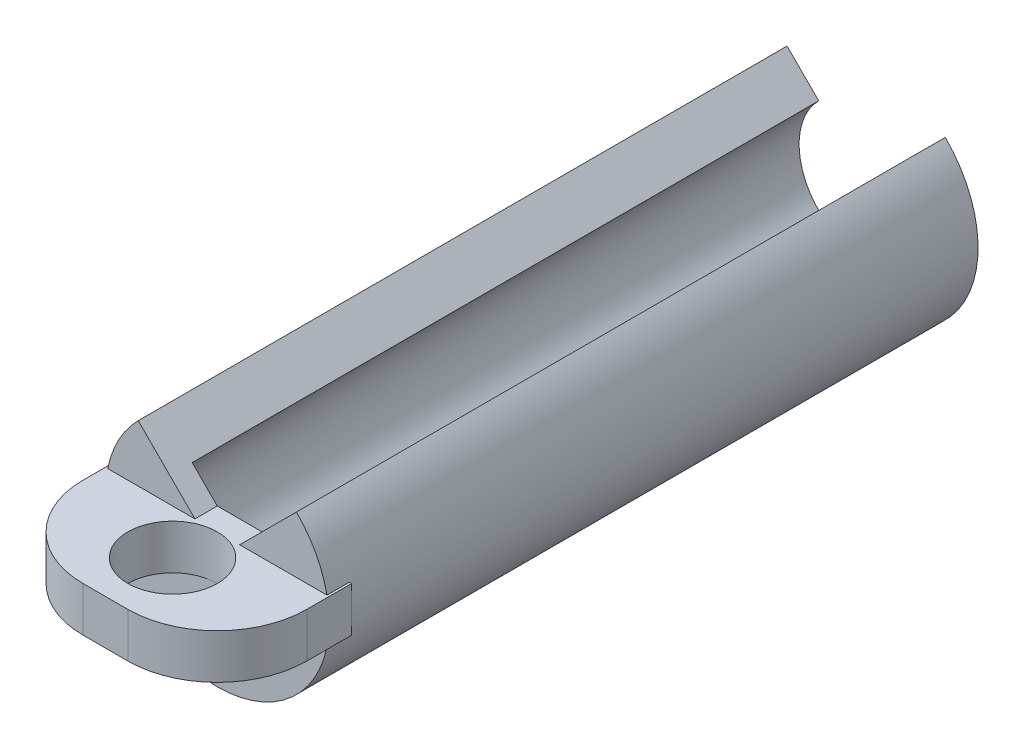
ISO-10303-21;
HEADER;
FILE_DESCRIPTION(('STEP AP214'),'2;1');
FILE_NAME('part.step','',(''),(''),'','','');
FILE_SCHEMA(('AUTOMOTIVE_DESIGN { 1 0 10303 214 1 1 1 1 }'));
ENDSEC;
DATA;
#1=APPLICATION_CONTEXT('core data for automotive mechanical design processes');
#2=APPLICATION_PROTOCOL_DEFINITION('international standard','automotive_design',2000,#1);
#3=PRODUCT_CONTEXT('',#1,'mechanical');
#4=PRODUCT('Part','Part','',(#3));
#5=PRODUCT_RELATED_PRODUCT_CATEGORY('part','',(#4));
#6=PRODUCT_DEFINITION_FORMATION('','',#4);
#7=PRODUCT_DEFINITION_CONTEXT('part definition',#1,'design');
#8=PRODUCT_DEFINITION('design','',#6,#7);
#9=PRODUCT_DEFINITION_SHAPE('','',#8);
#10=(LENGTH_UNIT() NAMED_UNIT(*) SI_UNIT(.MILLI.,.METRE.));
#11=(NAMED_UNIT(*) PLANE_ANGLE_UNIT() SI_UNIT($,.RADIAN.));
#12=(NAMED_UNIT(*) SI_UNIT($,.STERADIAN.) SOLID_ANGLE_UNIT());
#13=UNCERTAINTY_MEASURE_WITH_UNIT(LENGTH_MEASURE(1.E-05),#10,'distance_accuracy_value','');
#14=(GEOMETRIC_REPRESENTATION_CONTEXT(3) GLOBAL_UNCERTAINTY_ASSIGNED_CONTEXT((#13)) GLOBAL_UNIT_ASSIGNED_CONTEXT((#10,
#11,#12)) REPRESENTATION_CONTEXT('',''));
#15=CARTESIAN_POINT('',(0.,0.,0.));
#16=DIRECTION('',(0.,0.,1.));
#17=DIRECTION('',(1.,0.,0.));
#18=AXIS2_PLACEMENT_3D('',#15,#16,#17);
#19=CARTESIAN_POINT('',(0.,1.,29.));
#20=DIRECTION('',(0.,0.,-1.));
#21=DIRECTION('',(-1.,0.,0.));
#22=AXIS2_PLACEMENT_3D('',#19,#20,#21);
#23=PLANE('',#22);
#24=CARTESIAN_POINT('',(0.,0.,29.));
#25=DIRECTION('',(0.,0.,-1.));
#26=DIRECTION('',(-1.,0.,0.));
#27=AXIS2_PLACEMENT_3D('',#24,#25,#26);
#28=CIRCLE('',#27,5.);
#29=CARTESIAN_POINT('',(4.89897948556635,1.,29.));
#30=VERTEX_POINT('',#29);
#31=CARTESIAN_POINT('',(5.00000000000001,0.,29.));
#32=VERTEX_POINT('',#31);
#33=EDGE_CURVE('E219',#30,#32,#28,.T.);
#34=ORIENTED_EDGE('',*,*,#33,.F.);
#35=DIRECTION('',(1.,0.,0.));
#36=VECTOR('',#35,1.);
#37=CARTESIAN_POINT('',(0.,1.,29.));
#38=LINE('',#37,#36);
#39=CARTESIAN_POINT('',(5.00000000000001,1.,29.));
#40=VERTEX_POINT('',#39);
#41=EDGE_CURVE('E231',#30,#40,#38,.T.);
#42=ORIENTED_EDGE('',*,*,#41,.T.);
#43=DIRECTION('',(0.,-1.,0.));
#44=VECTOR('',#43,1.);
#45=CARTESIAN_POINT('',(5.00000000000001,1.,29.));
#46=LINE('',#45,#44);
#47=EDGE_CURVE('E275',#40,#32,#46,.T.);
#48=ORIENTED_EDGE('',*,*,#47,.T.);
#49=EDGE_LOOP('',(#34,#42,#48));
#50=FACE_BOUND('',#49,.T.);
#51=ADVANCED_FACE('F35',(#50),#23,.T.);
#52=CARTESIAN_POINT('',(-5.,0.,29.));
#53=VERTEX_POINT('',#52);
#54=CARTESIAN_POINT('',(-4.89897948556635,1.,29.));
#55=VERTEX_POINT('',#54);
#56=EDGE_CURVE('E58',#53,#55,#28,.T.);
#57=ORIENTED_EDGE('',*,*,#56,.F.);
#58=DIRECTION('',(0.,-1.,0.));
#59=VECTOR('',#58,1.);
#60=CARTESIAN_POINT('',(-5.,1.,29.));
#61=LINE('',#60,#59);
#62=CARTESIAN_POINT('',(-5.,1.,29.));
#63=VERTEX_POINT('',#62);
#64=EDGE_CURVE('E271',#63,#53,#61,.T.);
#65=ORIENTED_EDGE('',*,*,#64,.F.);
#66=EDGE_CURVE('E232',#63,#55,#38,.T.);
#67=ORIENTED_EDGE('',*,*,#66,.T.);
#68=EDGE_LOOP('',(#57,#65,#67));
#69=FACE_BOUND('',#68,.T.);
#70=ADVANCED_FACE('F338',(#69),#23,.T.);
#71=CARTESIAN_POINT('',(4.89897948556635,-1.,29.));
#72=VERTEX_POINT('',#71);
#73=EDGE_CURVE('E50',#32,#72,#28,.T.);
#74=ORIENTED_EDGE('',*,*,#73,.F.);
#75=CARTESIAN_POINT('',(5.00000000000001,-1.,29.));
#76=VERTEX_POINT('',#75);
#77=EDGE_CURVE('E274',#32,#76,#46,.T.);
#78=ORIENTED_EDGE('',*,*,#77,.T.);
#79=DIRECTION('',(1.,0.,0.));
#80=VECTOR('',#79,1.);
#81=CARTESIAN_POINT('',(0.,-1.,29.));
#82=LINE('',#81,#80);
#83=EDGE_CURVE('E250',#72,#76,#82,.T.);
#84=ORIENTED_EDGE('',*,*,#83,.F.);
#85=EDGE_LOOP('',(#74,#78,#84));
#86=FACE_BOUND('',#85,.T.);
#87=ADVANCED_FACE('F316',(#86),#23,.T.);
#88=CARTESIAN_POINT('',(-0.999999999999997,1.,29.));
#89=VERTEX_POINT('',#88);
#90=CARTESIAN_POINT('',(0.999999999999982,1.,29.));
#91=VERTEX_POINT('',#90);
#92=EDGE_CURVE('E235',#89,#91,#38,.T.);
#93=ORIENTED_EDGE('',*,*,#92,.T.);
#94=DIRECTION('',(-0.707106781186541,-0.707106781186554,0.));
#95=VECTOR('',#94,1.);
#96=CARTESIAN_POINT('',(0.,0.,29.));
#97=LINE('',#96,#95);
#98=CARTESIAN_POINT('',(2.12132034355962,2.12132034355966,29.));
#99=VERTEX_POINT('',#98);
#100=EDGE_CURVE('E199',#99,#91,#97,.T.);
#101=ORIENTED_EDGE('',*,*,#100,.F.);
#102=CARTESIAN_POINT('',(0.,0.,29.));
#103=DIRECTION('',(0.,0.,-1.));
#104=DIRECTION('',(-1.,0.,0.));
#105=AXIS2_PLACEMENT_3D('',#102,#103,#104);
#106=CIRCLE('',#105,3.);
#107=CARTESIAN_POINT('',(-2.12132034355964,2.12132034355964,29.));
#108=VERTEX_POINT('',#107);
#109=EDGE_CURVE('E170',#99,#108,#106,.T.);
#110=ORIENTED_EDGE('',*,*,#109,.T.);
#111=DIRECTION('',(0.707106781186546,-0.707106781186549,0.));
#112=VECTOR('',#111,1.);
#113=CARTESIAN_POINT('',(0.,0.,29.));
#114=LINE('',#113,#112);
#115=EDGE_CURVE('E184',#108,#89,#114,.T.);
#116=ORIENTED_EDGE('',*,*,#115,.T.);
#117=EDGE_LOOP('',(#93,#101,#110,#116));
#118=FACE_BOUND('',#117,.T.);
#119=ADVANCED_FACE('F290',(#118),#23,.T.);
#120=CARTESIAN_POINT('',(1.00000000000001,1.,31.));
#121=DIRECTION('',(0.,-1.,0.));
#122=DIRECTION('',(0.,0.,-1.));
#123=AXIS2_PLACEMENT_3D('',#120,#121,#122);
#124=CYLINDRICAL_SURFACE('',#123,4.);
#125=CARTESIAN_POINT('',(1.00000000000001,-1.,31.));
#126=DIRECTION('',(0.,1.,0.));
#127=DIRECTION('',(0.,0.,1.));
#128=AXIS2_PLACEMENT_3D('',#125,#126,#127);
#129=CIRCLE('',#128,4.);
#130=CARTESIAN_POINT('',(0.99999999999998,-1.,35.));
#131=VERTEX_POINT('',#130);
#132=CARTESIAN_POINT('',(5.00000000000001,-1.,31.));
#133=VERTEX_POINT('',#132);
#134=EDGE_CURVE('E224',#131,#133,#129,.T.);
#135=ORIENTED_EDGE('',*,*,#134,.T.);
#136=DIRECTION('',(0.,-1.,0.));
#137=VECTOR('',#136,1.);
#138=CARTESIAN_POINT('',(5.00000000000001,1.,31.));
#139=LINE('',#138,#137);
#140=CARTESIAN_POINT('',(5.00000000000001,1.,31.));
#141=VERTEX_POINT('',#140);
#142=EDGE_CURVE('E278',#141,#133,#139,.T.);
#143=ORIENTED_EDGE('',*,*,#142,.F.);
#144=CARTESIAN_POINT('',(1.00000000000001,1.,31.));
#145=DIRECTION('',(0.,1.,0.));
#146=DIRECTION('',(0.,0.,1.));
#147=AXIS2_PLACEMENT_3D('',#144,#145,#146);
#148=CIRCLE('',#147,4.);
#149=CARTESIAN_POINT('',(0.99999999999998,1.,35.));
#150=VERTEX_POINT('',#149);
#151=EDGE_CURVE('E225',#150,#141,#148,.T.);
#152=ORIENTED_EDGE('',*,*,#151,.F.);
#153=DIRECTION('',(0.,-1.,0.));
#154=VECTOR('',#153,1.);
#155=CARTESIAN_POINT('',(0.99999999999998,1.,35.));
#156=LINE('',#155,#154);
#157=EDGE_CURVE('E244',#150,#131,#156,.T.);
#158=ORIENTED_EDGE('',*,*,#157,.T.);
#159=EDGE_LOOP('',(#135,#143,#152,#158));
#160=FACE_BOUND('',#159,.T.);
#161=ADVANCED_FACE('F37',(#160),#124,.T.);
#162=CARTESIAN_POINT('',(5.,1.,0.));
#163=DIRECTION('',(1.,0.,0.));
#164=DIRECTION('',(0.,0.,-1.));
#165=AXIS2_PLACEMENT_3D('',#162,#163,#164);
#166=PLANE('',#165);
#167=ORIENTED_EDGE('',*,*,#77,.F.);
#168=ORIENTED_EDGE('',*,*,#47,.F.);
#169=DIRECTION('',(0.,0.,1.));
#170=VECTOR('',#169,1.);
#171=CARTESIAN_POINT('',(5.,1.,0.));
#172=LINE('',#171,#170);
#173=EDGE_CURVE('E227',#40,#141,#172,.T.);
#174=ORIENTED_EDGE('',*,*,#173,.T.);
#175=ORIENTED_EDGE('',*,*,#142,.T.);
#176=DIRECTION('',(0.,0.,1.));
#177=VECTOR('',#176,1.);
#178=CARTESIAN_POINT('',(5.,-1.,0.));
#179=LINE('',#178,#177);
#180=EDGE_CURVE('E247',#76,#133,#179,.T.);
#181=ORIENTED_EDGE('',*,*,#180,.F.);
#182=EDGE_LOOP('',(#167,#168,#174,#175,#181));
#183=FACE_BOUND('',#182,.T.);
#184=ADVANCED_FACE('F313',(#183),#166,.T.);
#185=CARTESIAN_POINT('',(-4.89897948556635,-1.,29.));
#186=VERTEX_POINT('',#185);
#187=EDGE_CURVE('E216',#186,#53,#28,.T.);
#188=ORIENTED_EDGE('',*,*,#187,.F.);
#189=CARTESIAN_POINT('',(-5.,-1.,29.));
#190=VERTEX_POINT('',#189);
#191=EDGE_CURVE('E251',#190,#186,#82,.T.);
#192=ORIENTED_EDGE('',*,*,#191,.F.);
#193=EDGE_CURVE('E270',#53,#190,#61,.T.);
#194=ORIENTED_EDGE('',*,*,#193,.F.);
#195=EDGE_LOOP('',(#188,#192,#194));
#196=FACE_BOUND('',#195,.T.);
#197=ADVANCED_FACE('F332',(#196),#23,.T.);
#198=CARTESIAN_POINT('',(-5.,1.,0.));
#199=DIRECTION('',(1.,0.,0.));
#200=DIRECTION('',(0.,0.,-1.));
#201=AXIS2_PLACEMENT_3D('',#198,#199,#200);
#202=PLANE('',#201);
#203=ORIENTED_EDGE('',*,*,#64,.T.);
#204=ORIENTED_EDGE('',*,*,#193,.T.);
#205=DIRECTION('',(0.,0.,1.));
#206=VECTOR('',#205,1.);
#207=CARTESIAN_POINT('',(-5.,-1.,0.));
#208=LINE('',#207,#206);
#209=CARTESIAN_POINT('',(-5.,-1.,31.));
#210=VERTEX_POINT('',#209);
#211=EDGE_CURVE('E254',#190,#210,#208,.T.);
#212=ORIENTED_EDGE('',*,*,#211,.T.);
#213=DIRECTION('',(0.,-1.,0.));
#214=VECTOR('',#213,1.);
#215=CARTESIAN_POINT('',(-5.,1.,31.));
#216=LINE('',#215,#214);
#217=CARTESIAN_POINT('',(-5.,1.,31.));
#218=VERTEX_POINT('',#217);
#219=EDGE_CURVE('E267',#218,#210,#216,.T.);
#220=ORIENTED_EDGE('',*,*,#219,.F.);
#221=DIRECTION('',(0.,0.,1.));
#222=VECTOR('',#221,1.);
#223=CARTESIAN_POINT('',(-5.,1.,0.));
#224=LINE('',#223,#222);
#225=EDGE_CURVE('E234',#63,#218,#224,.T.);
#226=ORIENTED_EDGE('',*,*,#225,.F.);
#227=EDGE_LOOP('',(#203,#204,#212,#220,#226));
#228=FACE_BOUND('',#227,.T.);
#229=ADVANCED_FACE('F335',(#228),#202,.F.);
#230=CARTESIAN_POINT('',(-0.999999999999996,1.,31.));
#231=DIRECTION('',(0.,-1.,0.));
#232=DIRECTION('',(0.,0.,-1.));
#233=AXIS2_PLACEMENT_3D('',#230,#231,#232);
#234=CYLINDRICAL_SURFACE('',#233,4.);
#235=CARTESIAN_POINT('',(-0.999999999999996,-1.,31.));
#236=DIRECTION('',(0.,1.,0.));
#237=DIRECTION('',(0.,0.,1.));
#238=AXIS2_PLACEMENT_3D('',#235,#236,#237);
#239=CIRCLE('',#238,4.);
#240=CARTESIAN_POINT('',(-0.999999999999967,-1.,35.));
#241=VERTEX_POINT('',#240);
#242=EDGE_CURVE('E256',#210,#241,#239,.T.);
#243=ORIENTED_EDGE('',*,*,#242,.T.);
#244=DIRECTION('',(0.,-1.,0.));
#245=VECTOR('',#244,1.);
#246=CARTESIAN_POINT('',(-0.999999999999967,1.,35.));
#247=LINE('',#246,#245);
#248=CARTESIAN_POINT('',(-0.999999999999967,1.,35.));
#249=VERTEX_POINT('',#248);
#250=EDGE_CURVE('E264',#249,#241,#247,.T.);
#251=ORIENTED_EDGE('',*,*,#250,.F.);
#252=CARTESIAN_POINT('',(-0.999999999999996,1.,31.));
#253=DIRECTION('',(0.,1.,0.));
#254=DIRECTION('',(0.,0.,1.));
#255=AXIS2_PLACEMENT_3D('',#252,#253,#254);
#256=CIRCLE('',#255,4.);
#257=EDGE_CURVE('E237',#218,#249,#256,.T.);
#258=ORIENTED_EDGE('',*,*,#257,.F.);
#259=ORIENTED_EDGE('',*,*,#219,.T.);
#260=EDGE_LOOP('',(#243,#251,#258,#259));
#261=FACE_BOUND('',#260,.T.);
#262=ADVANCED_FACE('F343',(#261),#234,.T.);
#263=CARTESIAN_POINT('',(0.,1.,35.));
#264=DIRECTION('',(0.,0.,-1.));
#265=DIRECTION('',(-1.,0.,0.));
#266=AXIS2_PLACEMENT_3D('',#263,#264,#265);
#267=PLANE('',#266);
#268=DIRECTION('',(1.,0.,0.));
#269=VECTOR('',#268,1.);
#270=CARTESIAN_POINT('',(0.,-1.,35.));
#271=LINE('',#270,#269);
#272=EDGE_CURVE('E258',#241,#131,#271,.T.);
#273=ORIENTED_EDGE('',*,*,#272,.T.);
#274=ORIENTED_EDGE('',*,*,#157,.F.);
#275=DIRECTION('',(1.,0.,0.));
#276=VECTOR('',#275,1.);
#277=CARTESIAN_POINT('',(0.,1.,35.));
#278=LINE('',#277,#276);
#279=EDGE_CURVE('E239',#249,#150,#278,.T.);
#280=ORIENTED_EDGE('',*,*,#279,.F.);
#281=ORIENTED_EDGE('',*,*,#250,.T.);
#282=EDGE_LOOP('',(#273,#274,#280,#281));
#283=FACE_BOUND('',#282,.T.);
#284=ADVANCED_FACE('F348',(#283),#267,.F.);
#285=CARTESIAN_POINT('',(0.,1.,32.));
#286=DIRECTION('',(0.,-1.,0.));
#287=DIRECTION('',(0.,0.,-1.));
#288=AXIS2_PLACEMENT_3D('',#285,#286,#287);
#289=CYLINDRICAL_SURFACE('',#288,2.);
#290=CARTESIAN_POINT('',(0.,-1.,32.));
#291=DIRECTION('',(0.,1.,0.));
#292=DIRECTION('',(0.,0.,1.));
#293=AXIS2_PLACEMENT_3D('',#290,#291,#292);
#294=CIRCLE('',#293,2.);
#295=CARTESIAN_POINT('',(0.,-1.,30.));
#296=VERTEX_POINT('',#295);
#297=EDGE_CURVE('E228',#296,#296,#294,.T.);
#298=ORIENTED_EDGE('',*,*,#297,.F.);
#299=EDGE_LOOP('',(#298));
#300=FACE_BOUND('',#299,.T.);
#301=CARTESIAN_POINT('',(0.,1.,32.));
#302=DIRECTION('',(0.,1.,0.));
#303=DIRECTION('',(0.,0.,1.));
#304=AXIS2_PLACEMENT_3D('',#301,#302,#303);
#305=CIRCLE('',#304,2.);
#306=CARTESIAN_POINT('',(0.,1.,34.));
#307=VERTEX_POINT('',#306);
#308=EDGE_CURVE('E241',#307,#307,#305,.T.);
#309=ORIENTED_EDGE('',*,*,#308,.T.);
#310=EDGE_LOOP('',(#309));
#311=FACE_BOUND('',#310,.T.);
#312=ADVANCED_FACE('F374',(#300,#311),#289,.F.);
#313=CARTESIAN_POINT('',(0.,1.,0.));
#314=DIRECTION('',(0.,1.,0.));
#315=DIRECTION('',(0.,0.,1.));
#316=AXIS2_PLACEMENT_3D('',#313,#314,#315);
#317=PLANE('',#316);
#318=DIRECTION('',(0.,0.,-1.));
#319=VECTOR('',#318,1.);
#320=CARTESIAN_POINT('',(4.89897948556635,1.,0.));
#321=LINE('',#320,#319);
#322=CARTESIAN_POINT('',(4.89897948556635,1.,30.));
#323=VERTEX_POINT('',#322);
#324=EDGE_CURVE('E221',#323,#30,#321,.T.);
#325=ORIENTED_EDGE('',*,*,#324,.F.);
#326=DIRECTION('',(1.,0.,0.));
#327=VECTOR('',#326,1.);
#328=CARTESIAN_POINT('',(0.,1.,30.));
#329=LINE('',#328,#327);
#330=CARTESIAN_POINT('',(0.999999999999982,1.,30.));
#331=VERTEX_POINT('',#330);
#332=EDGE_CURVE('E213',#331,#323,#329,.T.);
#333=ORIENTED_EDGE('',*,*,#332,.F.);
#334=DIRECTION('',(0.,0.,-1.));
#335=VECTOR('',#334,1.);
#336=CARTESIAN_POINT('',(0.999999999999982,1.,0.));
#337=LINE('',#336,#335);
#338=EDGE_CURVE('E11',#331,#91,#337,.T.);
#339=ORIENTED_EDGE('',*,*,#338,.T.);
#340=ORIENTED_EDGE('',*,*,#92,.F.);
#341=DIRECTION('',(0.,0.,-1.));
#342=VECTOR('',#341,1.);
#343=CARTESIAN_POINT('',(-0.999999999999997,1.,0.));
#344=LINE('',#343,#342);
#345=CARTESIAN_POINT('',(-0.999999999999997,1.,30.));
#346=VERTEX_POINT('',#345);
#347=EDGE_CURVE('E43',#346,#89,#344,.T.);
#348=ORIENTED_EDGE('',*,*,#347,.F.);
#349=CARTESIAN_POINT('',(-4.89897948556635,1.,30.));
#350=VERTEX_POINT('',#349);
#351=EDGE_CURVE('E183',#350,#346,#329,.T.);
#352=ORIENTED_EDGE('',*,*,#351,.F.);
#353=DIRECTION('',(0.,0.,-1.));
#354=VECTOR('',#353,1.);
#355=CARTESIAN_POINT('',(-4.89897948556635,1.,0.));
#356=LINE('',#355,#354);
#357=EDGE_CURVE('E165',#55,#350,#356,.F.);
#358=ORIENTED_EDGE('',*,*,#357,.F.);
#359=ORIENTED_EDGE('',*,*,#66,.F.);
#360=ORIENTED_EDGE('',*,*,#225,.T.);
#361=ORIENTED_EDGE('',*,*,#257,.T.);
#362=ORIENTED_EDGE('',*,*,#279,.T.);
#363=ORIENTED_EDGE('',*,*,#151,.T.);
#364=ORIENTED_EDGE('',*,*,#173,.F.);
#365=ORIENTED_EDGE('',*,*,#41,.F.);
#366=EDGE_LOOP('',(#325,#333,#339,#340,#348,#352,#358,#359,#360,#361,#362,#363,#364,#365));
#367=FACE_BOUND('',#366,.T.);
#368=ORIENTED_EDGE('',*,*,#308,.F.);
#369=EDGE_LOOP('',(#368));
#370=FACE_BOUND('',#369,.T.);
#371=ADVANCED_FACE('F307',(#367,#370),#317,.T.);
#372=CARTESIAN_POINT('',(0.,-1.,0.));
#373=DIRECTION('',(0.,1.,0.));
#374=DIRECTION('',(0.,0.,1.));
#375=AXIS2_PLACEMENT_3D('',#372,#373,#374);
#376=PLANE('',#375);
#377=DIRECTION('',(1.,0.,0.));
#378=VECTOR('',#377,1.);
#379=CARTESIAN_POINT('',(0.,-1.,30.));
#380=LINE('',#379,#378);
#381=CARTESIAN_POINT('',(4.89897948556635,-1.,30.));
#382=VERTEX_POINT('',#381);
#383=EDGE_CURVE('E280',#296,#382,#380,.T.);
#384=ORIENTED_EDGE('',*,*,#383,.T.);
#385=DIRECTION('',(0.,0.,-1.));
#386=VECTOR('',#385,1.);
#387=CARTESIAN_POINT('',(4.89897948556635,-1.,0.));
#388=LINE('',#387,#386);
#389=EDGE_CURVE('E285',#382,#72,#388,.T.);
#390=ORIENTED_EDGE('',*,*,#389,.T.);
#391=ORIENTED_EDGE('',*,*,#83,.T.);
#392=ORIENTED_EDGE('',*,*,#180,.T.);
#393=ORIENTED_EDGE('',*,*,#134,.F.);
#394=ORIENTED_EDGE('',*,*,#272,.F.);
#395=ORIENTED_EDGE('',*,*,#242,.F.);
#396=ORIENTED_EDGE('',*,*,#211,.F.);
#397=ORIENTED_EDGE('',*,*,#191,.T.);
#398=DIRECTION('',(0.,0.,-1.));
#399=VECTOR('',#398,1.);
#400=CARTESIAN_POINT('',(-4.89897948556635,-1.,0.));
#401=LINE('',#400,#399);
#402=CARTESIAN_POINT('',(-4.89897948556635,-1.,30.));
#403=VERTEX_POINT('',#402);
#404=EDGE_CURVE('E283',#186,#403,#401,.F.);
#405=ORIENTED_EDGE('',*,*,#404,.T.);
#406=EDGE_CURVE('E282',#403,#296,#380,.T.);
#407=ORIENTED_EDGE('',*,*,#406,.T.);
#408=ORIENTED_EDGE('',*,*,#297,.T.);
#409=EDGE_LOOP('',(#384,#390,#391,#392,#393,#394,#395,#396,#397,#405,#407,#408));
#410=FACE_BOUND('',#409,.T.);
#411=ADVANCED_FACE('F318',(#410),#376,.F.);
#412=CARTESIAN_POINT('',(0.,0.,30.));
#413=DIRECTION('',(0.,0.,1.));
#414=DIRECTION('',(1.,0.,0.));
#415=AXIS2_PLACEMENT_3D('',#412,#413,#414);
#416=PLANE('',#415);
#417=CARTESIAN_POINT('',(0.,0.,30.));
#418=DIRECTION('',(0.,0.,-1.));
#419=DIRECTION('',(-1.,0.,0.));
#420=AXIS2_PLACEMENT_3D('',#417,#418,#419);
#421=CIRCLE('',#420,5.);
#422=CARTESIAN_POINT('',(-3.53553390593273,3.53553390593274,30.));
#423=VERTEX_POINT('',#422);
#424=EDGE_CURVE('E159',#350,#423,#421,.T.);
#425=ORIENTED_EDGE('',*,*,#424,.F.);
#426=ORIENTED_EDGE('',*,*,#351,.T.);
#427=DIRECTION('',(0.707106781186546,-0.707106781186549,0.));
#428=VECTOR('',#427,1.);
#429=CARTESIAN_POINT('',(0.,0.,30.));
#430=LINE('',#429,#428);
#431=EDGE_CURVE('E177',#423,#346,#430,.T.);
#432=ORIENTED_EDGE('',*,*,#431,.F.);
#433=EDGE_LOOP('',(#425,#426,#432));
#434=FACE_BOUND('',#433,.T.);
#435=ADVANCED_FACE('F182',(#434),#416,.T.);
#436=ORIENTED_EDGE('',*,*,#406,.F.);
#437=EDGE_CURVE('E169',#382,#403,#421,.T.);
#438=ORIENTED_EDGE('',*,*,#437,.F.);
#439=ORIENTED_EDGE('',*,*,#383,.F.);
#440=EDGE_LOOP('',(#436,#438,#439));
#441=FACE_BOUND('',#440,.T.);
#442=ADVANCED_FACE('F327',(#441),#416,.T.);
#443=CARTESIAN_POINT('',(0.,0.,0.));
#444=DIRECTION('',(0.,0.,-1.));
#445=DIRECTION('',(-1.,0.,0.));
#446=AXIS2_PLACEMENT_3D('',#443,#444,#445);
#447=CYLINDRICAL_SURFACE('',#446,5.);
#448=CARTESIAN_POINT('',(3.5355339059327,3.53553390593277,30.));
#449=VERTEX_POINT('',#448);
#450=EDGE_CURVE('E172',#449,#323,#421,.T.);
#451=ORIENTED_EDGE('',*,*,#450,.T.);
#452=ORIENTED_EDGE('',*,*,#324,.T.);
#453=ORIENTED_EDGE('',*,*,#33,.T.);
#454=ORIENTED_EDGE('',*,*,#73,.T.);
#455=ORIENTED_EDGE('',*,*,#389,.F.);
#456=ORIENTED_EDGE('',*,*,#437,.T.);
#457=ORIENTED_EDGE('',*,*,#404,.F.);
#458=ORIENTED_EDGE('',*,*,#187,.T.);
#459=ORIENTED_EDGE('',*,*,#56,.T.);
#460=ORIENTED_EDGE('',*,*,#357,.T.);
#461=ORIENTED_EDGE('',*,*,#424,.T.);
#462=DIRECTION('',(0.,0.,1.));
#463=VECTOR('',#462,1.);
#464=CARTESIAN_POINT('',(-3.53553390593273,3.53553390593274,0.));
#465=LINE('',#464,#463);
#466=CARTESIAN_POINT('',(-3.53553390593273,3.53553390593274,1.));
#467=VERTEX_POINT('',#466);
#468=EDGE_CURVE('E163',#467,#423,#465,.T.);
#469=ORIENTED_EDGE('',*,*,#468,.F.);
#470=CARTESIAN_POINT('',(0.,0.,1.));
#471=DIRECTION('',(0.,0.,-1.));
#472=DIRECTION('',(-1.,0.,0.));
#473=AXIS2_PLACEMENT_3D('',#470,#471,#472);
#474=CIRCLE('',#473,5.);
#475=CARTESIAN_POINT('',(3.53553390593271,3.53553390593277,1.));
#476=VERTEX_POINT('',#475);
#477=EDGE_CURVE('E208',#476,#467,#474,.T.);
#478=ORIENTED_EDGE('',*,*,#477,.F.);
#479=DIRECTION('',(0.,0.,1.));
#480=VECTOR('',#479,1.);
#481=CARTESIAN_POINT('',(3.53553390593271,3.53553390593277,0.));
#482=LINE('',#481,#480);
#483=EDGE_CURVE('E193',#476,#449,#482,.T.);
#484=ORIENTED_EDGE('',*,*,#483,.T.);
#485=EDGE_LOOP('',(#451,#452,#453,#454,#455,#456,#457,#458,#459,#460,#461,#469,#478,#484));
#486=FACE_BOUND('',#485,.T.);
#487=ADVANCED_FACE('F162',(#486),#447,.T.);
#488=DIRECTION('',(-0.707106781186541,-0.707106781186554,0.));
#489=VECTOR('',#488,1.);
#490=CARTESIAN_POINT('',(0.,0.,30.));
#491=LINE('',#490,#489);
#492=EDGE_CURVE('E196',#449,#331,#491,.T.);
#493=ORIENTED_EDGE('',*,*,#492,.T.);
#494=ORIENTED_EDGE('',*,*,#332,.T.);
#495=ORIENTED_EDGE('',*,*,#450,.F.);
#496=EDGE_LOOP('',(#493,#494,#495));
#497=FACE_BOUND('',#496,.T.);
#498=ADVANCED_FACE('F304',(#497),#416,.T.);
#499=CARTESIAN_POINT('',(0.,0.,0.));
#500=DIRECTION('',(0.,0.,-1.));
#501=DIRECTION('',(-1.,0.,0.));
#502=AXIS2_PLACEMENT_3D('',#499,#500,#501);
#503=CYLINDRICAL_SURFACE('',#502,3.);
#504=CARTESIAN_POINT('',(0.,0.,1.));
#505=DIRECTION('',(0.,0.,-1.));
#506=DIRECTION('',(-1.,0.,0.));
#507=AXIS2_PLACEMENT_3D('',#504,#505,#506);
#508=CIRCLE('',#507,3.);
#509=CARTESIAN_POINT('',(2.12132034355962,2.12132034355966,1.));
#510=VERTEX_POINT('',#509);
#511=CARTESIAN_POINT('',(-2.12132034355964,2.12132034355965,1.));
#512=VERTEX_POINT('',#511);
#513=EDGE_CURVE('E210',#510,#512,#508,.T.);
#514=ORIENTED_EDGE('',*,*,#513,.T.);
#515=DIRECTION('',(0.,0.,1.));
#516=VECTOR('',#515,1.);
#517=CARTESIAN_POINT('',(-2.12132034355964,2.12132034355965,0.));
#518=LINE('',#517,#516);
#519=EDGE_CURVE('E187',#512,#108,#518,.T.);
#520=ORIENTED_EDGE('',*,*,#519,.T.);
#521=ORIENTED_EDGE('',*,*,#109,.F.);
#522=DIRECTION('',(0.,0.,1.));
#523=VECTOR('',#522,1.);
#524=CARTESIAN_POINT('',(2.12132034355962,2.12132034355966,0.));
#525=LINE('',#524,#523);
#526=EDGE_CURVE('E202',#510,#99,#525,.T.);
#527=ORIENTED_EDGE('',*,*,#526,.F.);
#528=EDGE_LOOP('',(#514,#520,#521,#527));
#529=FACE_BOUND('',#528,.T.);
#530=ADVANCED_FACE('F294',(#529),#503,.F.);
#531=CARTESIAN_POINT('',(0.,0.,1.));
#532=DIRECTION('',(0.,0.,1.));
#533=DIRECTION('',(1.,0.,0.));
#534=AXIS2_PLACEMENT_3D('',#531,#532,#533);
#535=PLANE('',#534);
#536=DIRECTION('',(-0.707106781186541,-0.707106781186554,0.));
#537=VECTOR('',#536,1.);
#538=CARTESIAN_POINT('',(0.,0.,1.));
#539=LINE('',#538,#537);
#540=EDGE_CURVE('E205',#476,#510,#539,.T.);
#541=ORIENTED_EDGE('',*,*,#540,.F.);
#542=ORIENTED_EDGE('',*,*,#477,.T.);
#543=DIRECTION('',(0.707106781186546,-0.707106781186549,0.));
#544=VECTOR('',#543,1.);
#545=CARTESIAN_POINT('',(0.,0.,1.));
#546=LINE('',#545,#544);
#547=EDGE_CURVE('E180',#467,#512,#546,.T.);
#548=ORIENTED_EDGE('',*,*,#547,.T.);
#549=ORIENTED_EDGE('',*,*,#513,.F.);
#550=EDGE_LOOP('',(#541,#542,#548,#549));
#551=FACE_BOUND('',#550,.T.);
#552=ADVANCED_FACE('F297',(#551),#535,.F.);
#553=CARTESIAN_POINT('',(0.,0.,0.));
#554=DIRECTION('',(0.707106781186554,-0.707106781186541,0.));
#555=DIRECTION('',(0.,0.,1.));
#556=AXIS2_PLACEMENT_3D('',#553,#554,#555);
#557=PLANE('',#556);
#558=ORIENTED_EDGE('',*,*,#338,.F.);
#559=ORIENTED_EDGE('',*,*,#492,.F.);
#560=ORIENTED_EDGE('',*,*,#483,.F.);
#561=ORIENTED_EDGE('',*,*,#540,.T.);
#562=ORIENTED_EDGE('',*,*,#526,.T.);
#563=ORIENTED_EDGE('',*,*,#100,.T.);
#564=EDGE_LOOP('',(#558,#559,#560,#561,#562,#563));
#565=FACE_BOUND('',#564,.T.);
#566=ADVANCED_FACE('F302',(#565),#557,.F.);
#567=CARTESIAN_POINT('',(0.,0.,0.));
#568=DIRECTION('',(0.707106781186549,0.707106781186546,0.));
#569=DIRECTION('',(0.,0.,1.));
#570=AXIS2_PLACEMENT_3D('',#567,#568,#569);
#571=PLANE('',#570);
#572=ORIENTED_EDGE('',*,*,#431,.T.);
#573=ORIENTED_EDGE('',*,*,#347,.T.);
#574=ORIENTED_EDGE('',*,*,#115,.F.);
#575=ORIENTED_EDGE('',*,*,#519,.F.);
#576=ORIENTED_EDGE('',*,*,#547,.F.);
#577=ORIENTED_EDGE('',*,*,#468,.T.);
#578=EDGE_LOOP('',(#572,#573,#574,#575,#576,#577));
#579=FACE_BOUND('',#578,.T.);
#580=ADVANCED_FACE('F175',(#579),#571,.T.);
#581=CLOSED_SHELL('',(#51,#70,#87,#119,#161,#184,#197,#229,#262,#284,#312,#371,#411,#435,#442,
#487,#498,#530,#552,#566,#580));
#582=MANIFOLD_SOLID_BREP('B2',#581);
#583=ADVANCED_BREP_SHAPE_REPRESENTATION('',(#18,#582),#14);
#584=SHAPE_DEFINITION_REPRESENTATION(#9,#583);
ENDSEC;
END-ISO-10303-21;
